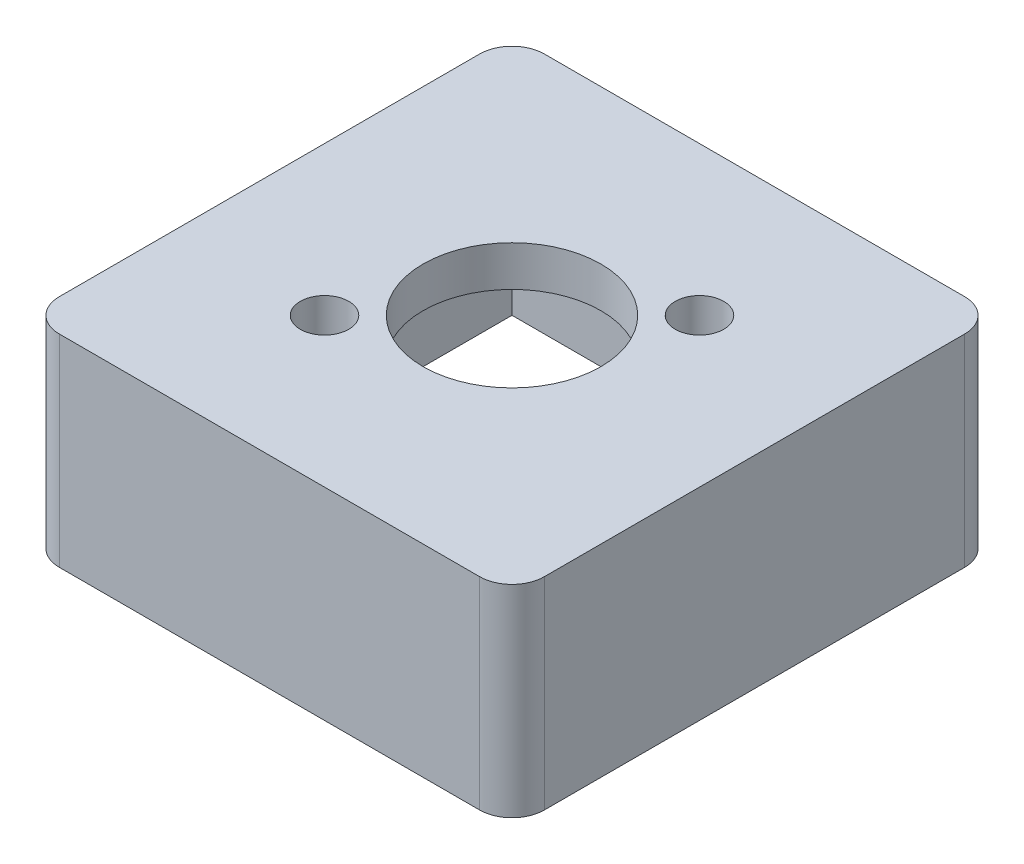
ISO-10303-21;
HEADER;
FILE_DESCRIPTION(('STEP AP214'),'2;1');
FILE_NAME('part.step','',(''),(''),'','','');
FILE_SCHEMA(('AUTOMOTIVE_DESIGN { 1 0 10303 214 1 1 1 1 }'));
ENDSEC;
DATA;
#1=APPLICATION_CONTEXT('core data for automotive mechanical design processes');
#2=APPLICATION_PROTOCOL_DEFINITION('international standard','automotive_design',2000,#1);
#3=PRODUCT_CONTEXT('',#1,'mechanical');
#4=PRODUCT('Part','Part','',(#3));
#5=PRODUCT_RELATED_PRODUCT_CATEGORY('part','',(#4));
#6=PRODUCT_DEFINITION_FORMATION('','',#4);
#7=PRODUCT_DEFINITION_CONTEXT('part definition',#1,'design');
#8=PRODUCT_DEFINITION('design','',#6,#7);
#9=PRODUCT_DEFINITION_SHAPE('','',#8);
#10=(LENGTH_UNIT() NAMED_UNIT(*) SI_UNIT(.MILLI.,.METRE.));
#11=(NAMED_UNIT(*) PLANE_ANGLE_UNIT() SI_UNIT($,.RADIAN.));
#12=(NAMED_UNIT(*) SI_UNIT($,.STERADIAN.) SOLID_ANGLE_UNIT());
#13=UNCERTAINTY_MEASURE_WITH_UNIT(LENGTH_MEASURE(1.E-05),#10,'distance_accuracy_value','');
#14=(GEOMETRIC_REPRESENTATION_CONTEXT(3) GLOBAL_UNCERTAINTY_ASSIGNED_CONTEXT((#13)) GLOBAL_UNIT_ASSIGNED_CONTEXT((#10,
#11,#12)) REPRESENTATION_CONTEXT('',''));
#15=CARTESIAN_POINT('',(0.,0.,0.));
#16=DIRECTION('',(0.,0.,1.));
#17=DIRECTION('',(1.,0.,0.));
#18=AXIS2_PLACEMENT_3D('',#15,#16,#17);
#19=CARTESIAN_POINT('',(0.,0.,0.));
#20=DIRECTION('',(0.,1.,0.));
#21=DIRECTION('',(0.,0.,1.));
#22=AXIS2_PLACEMENT_3D('',#19,#20,#21);
#23=PLANE('',#22);
#24=CARTESIAN_POINT('',(7.36381001927669,0.,-7.36381001927672));
#25=DIRECTION('',(0.,1.,0.));
#26=DIRECTION('',(0.,0.,1.));
#27=AXIS2_PLACEMENT_3D('',#24,#25,#26);
#28=CIRCLE('',#27,1.905);
#29=CARTESIAN_POINT('',(7.36381001927669,0.,-5.45881001927672));
#30=VERTEX_POINT('',#29);
#31=EDGE_CURVE('E208',#30,#30,#28,.F.);
#32=ORIENTED_EDGE('',*,*,#31,.F.);
#33=EDGE_LOOP('',(#32));
#34=FACE_BOUND('',#33,.T.);
#35=CARTESIAN_POINT('',(-7.36381001927671,0.,7.3638100192767));
#36=DIRECTION('',(0.,1.,0.));
#37=DIRECTION('',(0.,0.,1.));
#38=AXIS2_PLACEMENT_3D('',#35,#36,#37);
#39=CIRCLE('',#38,1.905);
#40=CARTESIAN_POINT('',(-7.36381001927671,0.,9.2688100192767));
#41=VERTEX_POINT('',#40);
#42=EDGE_CURVE('E234',#41,#41,#39,.T.);
#43=ORIENTED_EDGE('',*,*,#42,.T.);
#44=EDGE_LOOP('',(#43));
#45=FACE_BOUND('',#44,.T.);
#46=CARTESIAN_POINT('',(0.,0.,0.));
#47=DIRECTION('',(0.,1.,0.));
#48=DIRECTION('',(0.,0.,1.));
#49=AXIS2_PLACEMENT_3D('',#46,#47,#48);
#50=CIRCLE('',#49,6.985);
#51=CARTESIAN_POINT('',(0.,0.,6.985));
#52=VERTEX_POINT('',#51);
#53=EDGE_CURVE('E196',#52,#52,#50,.T.);
#54=ORIENTED_EDGE('',*,*,#53,.T.);
#55=EDGE_LOOP('',(#54));
#56=FACE_BOUND('',#55,.T.);
#57=DIRECTION('',(0.,0.,-1.));
#58=VECTOR('',#57,1.);
#59=CARTESIAN_POINT('',(15.875,0.,0.));
#60=LINE('',#59,#58);
#61=CARTESIAN_POINT('',(15.875,0.,15.875));
#62=VERTEX_POINT('',#61);
#63=CARTESIAN_POINT('',(15.875,0.,-15.875));
#64=VERTEX_POINT('',#63);
#65=EDGE_CURVE('E187',#62,#64,#60,.T.);
#66=ORIENTED_EDGE('',*,*,#65,.F.);
#67=DIRECTION('',(1.,0.,0.));
#68=VECTOR('',#67,1.);
#69=CARTESIAN_POINT('',(0.,0.,15.875));
#70=LINE('',#69,#68);
#71=CARTESIAN_POINT('',(-15.875,0.,15.875));
#72=VERTEX_POINT('',#71);
#73=EDGE_CURVE('E150',#72,#62,#70,.T.);
#74=ORIENTED_EDGE('',*,*,#73,.F.);
#75=DIRECTION('',(0.,0.,-1.));
#76=VECTOR('',#75,1.);
#77=CARTESIAN_POINT('',(-15.875,0.,0.));
#78=LINE('',#77,#76);
#79=CARTESIAN_POINT('',(-15.875,0.,-15.875));
#80=VERTEX_POINT('',#79);
#81=EDGE_CURVE('E165',#72,#80,#78,.T.);
#82=ORIENTED_EDGE('',*,*,#81,.T.);
#83=DIRECTION('',(1.,0.,0.));
#84=VECTOR('',#83,1.);
#85=CARTESIAN_POINT('',(0.,0.,-15.875));
#86=LINE('',#85,#84);
#87=EDGE_CURVE('E162',#80,#64,#86,.T.);
#88=ORIENTED_EDGE('',*,*,#87,.T.);
#89=EDGE_LOOP('',(#66,#74,#82,#88));
#90=FACE_BOUND('',#89,.T.);
#91=ADVANCED_FACE('F40',(#34,#45,#56,#90),#23,.F.);
#92=CARTESIAN_POINT('',(0.,3.175,19.05));
#93=DIRECTION('',(0.,0.,-1.));
#94=DIRECTION('',(-1.,0.,0.));
#95=AXIS2_PLACEMENT_3D('',#92,#93,#94);
#96=PLANE('',#95);
#97=DIRECTION('',(1.,0.,0.));
#98=VECTOR('',#97,1.);
#99=CARTESIAN_POINT('',(0.,3.175,19.05));
#100=LINE('',#99,#98);
#101=CARTESIAN_POINT('',(-16.51,3.175,19.05));
#102=VERTEX_POINT('',#101);
#103=CARTESIAN_POINT('',(16.51,3.175,19.05));
#104=VERTEX_POINT('',#103);
#105=EDGE_CURVE('E216',#102,#104,#100,.T.);
#106=ORIENTED_EDGE('',*,*,#105,.F.);
#107=DIRECTION('',(0.,-1.,0.));
#108=VECTOR('',#107,1.);
#109=CARTESIAN_POINT('',(-16.51,-12.7,19.05));
#110=LINE('',#109,#108);
#111=CARTESIAN_POINT('',(-16.51,-12.7,19.05));
#112=VERTEX_POINT('',#111);
#113=EDGE_CURVE('E11',#102,#112,#110,.T.);
#114=ORIENTED_EDGE('',*,*,#113,.T.);
#115=DIRECTION('',(1.,0.,0.));
#116=VECTOR('',#115,1.);
#117=CARTESIAN_POINT('',(0.,-12.7,19.05));
#118=LINE('',#117,#116);
#119=CARTESIAN_POINT('',(16.51,-12.7,19.05));
#120=VERTEX_POINT('',#119);
#121=EDGE_CURVE('E173',#112,#120,#118,.T.);
#122=ORIENTED_EDGE('',*,*,#121,.T.);
#123=DIRECTION('',(0.,-1.,0.));
#124=VECTOR('',#123,1.);
#125=CARTESIAN_POINT('',(16.51,3.175,19.05));
#126=LINE('',#125,#124);
#127=EDGE_CURVE('E49',#120,#104,#126,.F.);
#128=ORIENTED_EDGE('',*,*,#127,.T.);
#129=EDGE_LOOP('',(#106,#114,#122,#128));
#130=FACE_BOUND('',#129,.T.);
#131=ADVANCED_FACE('F286',(#130),#96,.F.);
#132=CARTESIAN_POINT('',(19.05,3.175,0.));
#133=DIRECTION('',(-1.,0.,0.));
#134=DIRECTION('',(0.,0.,1.));
#135=AXIS2_PLACEMENT_3D('',#132,#133,#134);
#136=PLANE('',#135);
#137=DIRECTION('',(0.,0.,-1.));
#138=VECTOR('',#137,1.);
#139=CARTESIAN_POINT('',(19.05,-12.7,0.));
#140=LINE('',#139,#138);
#141=CARTESIAN_POINT('',(19.05,-12.7,16.51));
#142=VERTEX_POINT('',#141);
#143=CARTESIAN_POINT('',(19.05,-12.7,-16.51));
#144=VERTEX_POINT('',#143);
#145=EDGE_CURVE('E177',#142,#144,#140,.T.);
#146=ORIENTED_EDGE('',*,*,#145,.T.);
#147=DIRECTION('',(0.,-1.,0.));
#148=VECTOR('',#147,1.);
#149=CARTESIAN_POINT('',(19.05,3.175,-16.51));
#150=LINE('',#149,#148);
#151=CARTESIAN_POINT('',(19.05,3.175,-16.51));
#152=VERTEX_POINT('',#151);
#153=EDGE_CURVE('E56',#144,#152,#150,.F.);
#154=ORIENTED_EDGE('',*,*,#153,.T.);
#155=DIRECTION('',(0.,0.,-1.));
#156=VECTOR('',#155,1.);
#157=CARTESIAN_POINT('',(19.05,3.175,0.));
#158=LINE('',#157,#156);
#159=CARTESIAN_POINT('',(19.05,3.175,16.51));
#160=VERTEX_POINT('',#159);
#161=EDGE_CURVE('E219',#160,#152,#158,.T.);
#162=ORIENTED_EDGE('',*,*,#161,.F.);
#163=DIRECTION('',(0.,-1.,0.));
#164=VECTOR('',#163,1.);
#165=CARTESIAN_POINT('',(19.05,3.175,16.51));
#166=LINE('',#165,#164);
#167=EDGE_CURVE('E277',#160,#142,#166,.T.);
#168=ORIENTED_EDGE('',*,*,#167,.T.);
#169=EDGE_LOOP('',(#146,#154,#162,#168));
#170=FACE_BOUND('',#169,.T.);
#171=ADVANCED_FACE('F296',(#170),#136,.F.);
#172=CARTESIAN_POINT('',(0.,3.175,-19.05));
#173=DIRECTION('',(0.,0.,-1.));
#174=DIRECTION('',(-1.,0.,0.));
#175=AXIS2_PLACEMENT_3D('',#172,#173,#174);
#176=PLANE('',#175);
#177=DIRECTION('',(1.,0.,0.));
#178=VECTOR('',#177,1.);
#179=CARTESIAN_POINT('',(0.,-12.7,-19.05));
#180=LINE('',#179,#178);
#181=CARTESIAN_POINT('',(-16.51,-12.7,-19.05));
#182=VERTEX_POINT('',#181);
#183=CARTESIAN_POINT('',(16.51,-12.7,-19.05));
#184=VERTEX_POINT('',#183);
#185=EDGE_CURVE('E180',#182,#184,#180,.T.);
#186=ORIENTED_EDGE('',*,*,#185,.F.);
#187=DIRECTION('',(0.,-1.,0.));
#188=VECTOR('',#187,1.);
#189=CARTESIAN_POINT('',(-16.51,3.175,-19.05));
#190=LINE('',#189,#188);
#191=CARTESIAN_POINT('',(-16.51,3.175,-19.05));
#192=VERTEX_POINT('',#191);
#193=EDGE_CURVE('E263',#182,#192,#190,.F.);
#194=ORIENTED_EDGE('',*,*,#193,.T.);
#195=DIRECTION('',(1.,0.,0.));
#196=VECTOR('',#195,1.);
#197=CARTESIAN_POINT('',(0.,3.175,-19.05));
#198=LINE('',#197,#196);
#199=CARTESIAN_POINT('',(16.51,3.175,-19.05));
#200=VERTEX_POINT('',#199);
#201=EDGE_CURVE('E222',#192,#200,#198,.T.);
#202=ORIENTED_EDGE('',*,*,#201,.T.);
#203=DIRECTION('',(0.,-1.,0.));
#204=VECTOR('',#203,1.);
#205=CARTESIAN_POINT('',(16.51,-12.7,-19.05));
#206=LINE('',#205,#204);
#207=EDGE_CURVE('E259',#200,#184,#206,.T.);
#208=ORIENTED_EDGE('',*,*,#207,.T.);
#209=EDGE_LOOP('',(#186,#194,#202,#208));
#210=FACE_BOUND('',#209,.T.);
#211=ADVANCED_FACE('F303',(#210),#176,.T.);
#212=CARTESIAN_POINT('',(7.36381001927669,3.175,-7.36381001927672));
#213=DIRECTION('',(0.,-1.,0.));
#214=DIRECTION('',(0.,0.,-1.));
#215=AXIS2_PLACEMENT_3D('',#212,#213,#214);
#216=CYLINDRICAL_SURFACE('',#215,1.905);
#217=CARTESIAN_POINT('',(7.36381001927669,3.175,-7.36381001927672));
#218=DIRECTION('',(0.,1.,0.));
#219=DIRECTION('',(0.,0.,1.));
#220=AXIS2_PLACEMENT_3D('',#217,#218,#219);
#221=CIRCLE('',#220,1.905);
#222=CARTESIAN_POINT('',(7.36381001927669,3.175,-5.45881001927672));
#223=VERTEX_POINT('',#222);
#224=EDGE_CURVE('E212',#223,#223,#221,.F.);
#225=ORIENTED_EDGE('',*,*,#224,.F.);
#226=EDGE_LOOP('',(#225));
#227=FACE_BOUND('',#226,.T.);
#228=ORIENTED_EDGE('',*,*,#31,.T.);
#229=EDGE_LOOP('',(#228));
#230=FACE_BOUND('',#229,.T.);
#231=ADVANCED_FACE('F339',(#227,#230),#216,.F.);
#232=CARTESIAN_POINT('',(-7.36381001927671,3.175,7.3638100192767));
#233=DIRECTION('',(0.,-1.,0.));
#234=DIRECTION('',(0.,0.,-1.));
#235=AXIS2_PLACEMENT_3D('',#232,#233,#234);
#236=CYLINDRICAL_SURFACE('',#235,1.905);
#237=CARTESIAN_POINT('',(-7.36381001927671,3.175,7.3638100192767));
#238=DIRECTION('',(0.,1.,0.));
#239=DIRECTION('',(0.,0.,1.));
#240=AXIS2_PLACEMENT_3D('',#237,#238,#239);
#241=CIRCLE('',#240,1.905);
#242=CARTESIAN_POINT('',(-7.36381001927671,3.175,9.2688100192767));
#243=VERTEX_POINT('',#242);
#244=EDGE_CURVE('E207',#243,#243,#241,.T.);
#245=ORIENTED_EDGE('',*,*,#244,.T.);
#246=EDGE_LOOP('',(#245));
#247=FACE_BOUND('',#246,.T.);
#248=ORIENTED_EDGE('',*,*,#42,.F.);
#249=EDGE_LOOP('',(#248));
#250=FACE_BOUND('',#249,.T.);
#251=ADVANCED_FACE('F344',(#247,#250),#236,.F.);
#252=CARTESIAN_POINT('',(0.,3.175,0.));
#253=DIRECTION('',(0.,-1.,0.));
#254=DIRECTION('',(0.,0.,-1.));
#255=AXIS2_PLACEMENT_3D('',#252,#253,#254);
#256=CYLINDRICAL_SURFACE('',#255,6.985);
#257=CARTESIAN_POINT('',(0.,3.175,0.));
#258=DIRECTION('',(0.,1.,0.));
#259=DIRECTION('',(0.,0.,1.));
#260=AXIS2_PLACEMENT_3D('',#257,#258,#259);
#261=CIRCLE('',#260,6.985);
#262=CARTESIAN_POINT('',(0.,3.175,6.985));
#263=VERTEX_POINT('',#262);
#264=EDGE_CURVE('E203',#263,#263,#261,.T.);
#265=ORIENTED_EDGE('',*,*,#264,.T.);
#266=EDGE_LOOP('',(#265));
#267=FACE_BOUND('',#266,.T.);
#268=ORIENTED_EDGE('',*,*,#53,.F.);
#269=EDGE_LOOP('',(#268));
#270=FACE_BOUND('',#269,.T.);
#271=ADVANCED_FACE('F336',(#267,#270),#256,.F.);
#272=CARTESIAN_POINT('',(-19.05,3.175,0.));
#273=DIRECTION('',(-1.,0.,0.));
#274=DIRECTION('',(0.,0.,1.));
#275=AXIS2_PLACEMENT_3D('',#272,#273,#274);
#276=PLANE('',#275);
#277=DIRECTION('',(0.,0.,-1.));
#278=VECTOR('',#277,1.);
#279=CARTESIAN_POINT('',(-19.05,3.175,0.));
#280=LINE('',#279,#278);
#281=CARTESIAN_POINT('',(-19.05,3.175,16.51));
#282=VERTEX_POINT('',#281);
#283=CARTESIAN_POINT('',(-19.05,3.175,-16.51));
#284=VERTEX_POINT('',#283);
#285=EDGE_CURVE('E226',#282,#284,#280,.T.);
#286=ORIENTED_EDGE('',*,*,#285,.T.);
#287=DIRECTION('',(0.,-1.,0.));
#288=VECTOR('',#287,1.);
#289=CARTESIAN_POINT('',(-19.05,3.175,-16.51));
#290=LINE('',#289,#288);
#291=CARTESIAN_POINT('',(-19.05,-12.7,-16.51));
#292=VERTEX_POINT('',#291);
#293=EDGE_CURVE('E243',#284,#292,#290,.T.);
#294=ORIENTED_EDGE('',*,*,#293,.T.);
#295=DIRECTION('',(0.,0.,-1.));
#296=VECTOR('',#295,1.);
#297=CARTESIAN_POINT('',(-19.05,-12.7,0.));
#298=LINE('',#297,#296);
#299=CARTESIAN_POINT('',(-19.05,-12.7,16.51));
#300=VERTEX_POINT('',#299);
#301=EDGE_CURVE('E155',#300,#292,#298,.T.);
#302=ORIENTED_EDGE('',*,*,#301,.F.);
#303=DIRECTION('',(0.,-1.,0.));
#304=VECTOR('',#303,1.);
#305=CARTESIAN_POINT('',(-19.05,3.175,16.51));
#306=LINE('',#305,#304);
#307=EDGE_CURVE('E230',#300,#282,#306,.F.);
#308=ORIENTED_EDGE('',*,*,#307,.T.);
#309=EDGE_LOOP('',(#286,#294,#302,#308));
#310=FACE_BOUND('',#309,.T.);
#311=ADVANCED_FACE('F311',(#310),#276,.T.);
#312=CARTESIAN_POINT('',(0.,3.175,0.));
#313=DIRECTION('',(0.,1.,0.));
#314=DIRECTION('',(0.,0.,1.));
#315=AXIS2_PLACEMENT_3D('',#312,#313,#314);
#316=PLANE('',#315);
#317=ORIENTED_EDGE('',*,*,#264,.F.);
#318=EDGE_LOOP('',(#317));
#319=FACE_BOUND('',#318,.T.);
#320=ORIENTED_EDGE('',*,*,#244,.F.);
#321=EDGE_LOOP('',(#320));
#322=FACE_BOUND('',#321,.T.);
#323=ORIENTED_EDGE('',*,*,#224,.T.);
#324=EDGE_LOOP('',(#323));
#325=FACE_BOUND('',#324,.T.);
#326=ORIENTED_EDGE('',*,*,#201,.F.);
#327=CARTESIAN_POINT('',(-16.51,3.175,-16.51));
#328=DIRECTION('',(0.,1.,0.));
#329=DIRECTION('',(0.,0.,1.));
#330=AXIS2_PLACEMENT_3D('',#327,#328,#329);
#331=CIRCLE('',#330,2.54);
#332=EDGE_CURVE('E274',#192,#284,#331,.T.);
#333=ORIENTED_EDGE('',*,*,#332,.T.);
#334=ORIENTED_EDGE('',*,*,#285,.F.);
#335=CARTESIAN_POINT('',(-16.51,3.175,16.51));
#336=DIRECTION('',(0.,1.,0.));
#337=DIRECTION('',(0.,0.,1.));
#338=AXIS2_PLACEMENT_3D('',#335,#336,#337);
#339=CIRCLE('',#338,2.54);
#340=EDGE_CURVE('E268',#282,#102,#339,.T.);
#341=ORIENTED_EDGE('',*,*,#340,.T.);
#342=ORIENTED_EDGE('',*,*,#105,.T.);
#343=CARTESIAN_POINT('',(16.51,3.175,16.51));
#344=DIRECTION('',(0.,1.,0.));
#345=DIRECTION('',(0.,0.,1.));
#346=AXIS2_PLACEMENT_3D('',#343,#344,#345);
#347=CIRCLE('',#346,2.54);
#348=EDGE_CURVE('E63',#104,#160,#347,.T.);
#349=ORIENTED_EDGE('',*,*,#348,.T.);
#350=ORIENTED_EDGE('',*,*,#161,.T.);
#351=CARTESIAN_POINT('',(16.51,3.175,-16.51));
#352=DIRECTION('',(0.,1.,0.));
#353=DIRECTION('',(0.,0.,1.));
#354=AXIS2_PLACEMENT_3D('',#351,#352,#353);
#355=CIRCLE('',#354,2.54);
#356=EDGE_CURVE('E271',#152,#200,#355,.T.);
#357=ORIENTED_EDGE('',*,*,#356,.T.);
#358=EDGE_LOOP('',(#326,#333,#334,#341,#342,#349,#350,#357));
#359=FACE_BOUND('',#358,.T.);
#360=ADVANCED_FACE('F291',(#319,#322,#325,#359),#316,.T.);
#361=CARTESIAN_POINT('',(15.875,-12.7,0.));
#362=DIRECTION('',(1.,0.,0.));
#363=DIRECTION('',(0.,0.,-1.));
#364=AXIS2_PLACEMENT_3D('',#361,#362,#363);
#365=PLANE('',#364);
#366=ORIENTED_EDGE('',*,*,#65,.T.);
#367=DIRECTION('',(0.,1.,0.));
#368=VECTOR('',#367,1.);
#369=CARTESIAN_POINT('',(15.875,-12.7,-15.875));
#370=LINE('',#369,#368);
#371=CARTESIAN_POINT('',(15.875,-12.7,-15.875));
#372=VERTEX_POINT('',#371);
#373=EDGE_CURVE('E159',#372,#64,#370,.T.);
#374=ORIENTED_EDGE('',*,*,#373,.F.);
#375=DIRECTION('',(0.,0.,-1.));
#376=VECTOR('',#375,1.);
#377=CARTESIAN_POINT('',(15.875,-12.7,0.));
#378=LINE('',#377,#376);
#379=CARTESIAN_POINT('',(15.875,-12.7,15.875));
#380=VERTEX_POINT('',#379);
#381=EDGE_CURVE('E138',#380,#372,#378,.T.);
#382=ORIENTED_EDGE('',*,*,#381,.F.);
#383=DIRECTION('',(0.,1.,0.));
#384=VECTOR('',#383,1.);
#385=CARTESIAN_POINT('',(15.875,-12.7,15.875));
#386=LINE('',#385,#384);
#387=EDGE_CURVE('E148',#380,#62,#386,.T.);
#388=ORIENTED_EDGE('',*,*,#387,.T.);
#389=EDGE_LOOP('',(#366,#374,#382,#388));
#390=FACE_BOUND('',#389,.T.);
#391=ADVANCED_FACE('F157',(#390),#365,.F.);
#392=CARTESIAN_POINT('',(0.,-12.7,-15.875));
#393=DIRECTION('',(0.,0.,1.));
#394=DIRECTION('',(1.,0.,0.));
#395=AXIS2_PLACEMENT_3D('',#392,#393,#394);
#396=PLANE('',#395);
#397=ORIENTED_EDGE('',*,*,#87,.F.);
#398=DIRECTION('',(0.,1.,0.));
#399=VECTOR('',#398,1.);
#400=CARTESIAN_POINT('',(-15.875,-12.7,-15.875));
#401=LINE('',#400,#399);
#402=CARTESIAN_POINT('',(-15.875,-12.7,-15.875));
#403=VERTEX_POINT('',#402);
#404=EDGE_CURVE('E197',#403,#80,#401,.T.);
#405=ORIENTED_EDGE('',*,*,#404,.F.);
#406=DIRECTION('',(1.,0.,0.));
#407=VECTOR('',#406,1.);
#408=CARTESIAN_POINT('',(0.,-12.7,-15.875));
#409=LINE('',#408,#407);
#410=EDGE_CURVE('E170',#403,#372,#409,.T.);
#411=ORIENTED_EDGE('',*,*,#410,.T.);
#412=ORIENTED_EDGE('',*,*,#373,.T.);
#413=EDGE_LOOP('',(#397,#405,#411,#412));
#414=FACE_BOUND('',#413,.T.);
#415=ADVANCED_FACE('F364',(#414),#396,.T.);
#416=CARTESIAN_POINT('',(-15.875,-12.7,0.));
#417=DIRECTION('',(1.,0.,0.));
#418=DIRECTION('',(0.,0.,-1.));
#419=AXIS2_PLACEMENT_3D('',#416,#417,#418);
#420=PLANE('',#419);
#421=ORIENTED_EDGE('',*,*,#81,.F.);
#422=DIRECTION('',(0.,1.,0.));
#423=VECTOR('',#422,1.);
#424=CARTESIAN_POINT('',(-15.875,-12.7,15.875));
#425=LINE('',#424,#423);
#426=CARTESIAN_POINT('',(-15.875,-12.7,15.875));
#427=VERTEX_POINT('',#426);
#428=EDGE_CURVE('E154',#427,#72,#425,.T.);
#429=ORIENTED_EDGE('',*,*,#428,.F.);
#430=DIRECTION('',(0.,0.,-1.));
#431=VECTOR('',#430,1.);
#432=CARTESIAN_POINT('',(-15.875,-12.7,0.));
#433=LINE('',#432,#431);
#434=EDGE_CURVE('E141',#427,#403,#433,.T.);
#435=ORIENTED_EDGE('',*,*,#434,.T.);
#436=ORIENTED_EDGE('',*,*,#404,.T.);
#437=EDGE_LOOP('',(#421,#429,#435,#436));
#438=FACE_BOUND('',#437,.T.);
#439=ADVANCED_FACE('F361',(#438),#420,.T.);
#440=CARTESIAN_POINT('',(0.,-12.7,15.875));
#441=DIRECTION('',(0.,0.,1.));
#442=DIRECTION('',(1.,0.,0.));
#443=AXIS2_PLACEMENT_3D('',#440,#441,#442);
#444=PLANE('',#443);
#445=ORIENTED_EDGE('',*,*,#73,.T.);
#446=ORIENTED_EDGE('',*,*,#387,.F.);
#447=DIRECTION('',(1.,0.,0.));
#448=VECTOR('',#447,1.);
#449=CARTESIAN_POINT('',(0.,-12.7,15.875));
#450=LINE('',#449,#448);
#451=EDGE_CURVE('E132',#427,#380,#450,.T.);
#452=ORIENTED_EDGE('',*,*,#451,.F.);
#453=ORIENTED_EDGE('',*,*,#428,.T.);
#454=EDGE_LOOP('',(#445,#446,#452,#453));
#455=FACE_BOUND('',#454,.T.);
#456=ADVANCED_FACE('F149',(#455),#444,.F.);
#457=CARTESIAN_POINT('',(0.,-12.7,0.));
#458=DIRECTION('',(0.,1.,0.));
#459=DIRECTION('',(0.,0.,1.));
#460=AXIS2_PLACEMENT_3D('',#457,#458,#459);
#461=PLANE('',#460);
#462=ORIENTED_EDGE('',*,*,#381,.T.);
#463=ORIENTED_EDGE('',*,*,#410,.F.);
#464=ORIENTED_EDGE('',*,*,#434,.F.);
#465=ORIENTED_EDGE('',*,*,#451,.T.);
#466=EDGE_LOOP('',(#462,#463,#464,#465));
#467=FACE_BOUND('',#466,.T.);
#468=ORIENTED_EDGE('',*,*,#301,.T.);
#469=CARTESIAN_POINT('',(-16.51,-12.7,-16.51));
#470=DIRECTION('',(0.,1.,0.));
#471=DIRECTION('',(0.,0.,1.));
#472=AXIS2_PLACEMENT_3D('',#469,#470,#471);
#473=CIRCLE('',#472,2.54);
#474=EDGE_CURVE('E256',#292,#182,#473,.F.);
#475=ORIENTED_EDGE('',*,*,#474,.T.);
#476=ORIENTED_EDGE('',*,*,#185,.T.);
#477=CARTESIAN_POINT('',(16.51,-12.7,-16.51));
#478=DIRECTION('',(0.,1.,0.));
#479=DIRECTION('',(0.,0.,1.));
#480=AXIS2_PLACEMENT_3D('',#477,#478,#479);
#481=CIRCLE('',#480,2.54);
#482=EDGE_CURVE('E253',#184,#144,#481,.F.);
#483=ORIENTED_EDGE('',*,*,#482,.T.);
#484=ORIENTED_EDGE('',*,*,#145,.F.);
#485=CARTESIAN_POINT('',(16.51,-12.7,16.51));
#486=DIRECTION('',(0.,1.,0.));
#487=DIRECTION('',(0.,0.,1.));
#488=AXIS2_PLACEMENT_3D('',#485,#486,#487);
#489=CIRCLE('',#488,2.54);
#490=EDGE_CURVE('E247',#142,#120,#489,.F.);
#491=ORIENTED_EDGE('',*,*,#490,.T.);
#492=ORIENTED_EDGE('',*,*,#121,.F.);
#493=CARTESIAN_POINT('',(-16.51,-12.7,16.51));
#494=DIRECTION('',(0.,1.,0.));
#495=DIRECTION('',(0.,0.,1.));
#496=AXIS2_PLACEMENT_3D('',#493,#494,#495);
#497=CIRCLE('',#496,2.54);
#498=EDGE_CURVE('E250',#112,#300,#497,.F.);
#499=ORIENTED_EDGE('',*,*,#498,.T.);
#500=EDGE_LOOP('',(#468,#475,#476,#483,#484,#491,#492,#499));
#501=FACE_BOUND('',#500,.T.);
#502=ADVANCED_FACE('F134',(#467,#501),#461,.F.);
#503=CARTESIAN_POINT('',(-16.51,3.175,-16.51));
#504=DIRECTION('',(0.,-1.,0.));
#505=DIRECTION('',(0.,0.,-1.));
#506=AXIS2_PLACEMENT_3D('',#503,#504,#505);
#507=CYLINDRICAL_SURFACE('',#506,2.54);
#508=ORIENTED_EDGE('',*,*,#332,.F.);
#509=ORIENTED_EDGE('',*,*,#193,.F.);
#510=ORIENTED_EDGE('',*,*,#474,.F.);
#511=ORIENTED_EDGE('',*,*,#293,.F.);
#512=EDGE_LOOP('',(#508,#509,#510,#511));
#513=FACE_BOUND('',#512,.T.);
#514=ADVANCED_FACE('F308',(#513),#507,.T.);
#515=CARTESIAN_POINT('',(16.51,3.175,-16.51));
#516=DIRECTION('',(0.,1.,0.));
#517=DIRECTION('',(0.,0.,1.));
#518=AXIS2_PLACEMENT_3D('',#515,#516,#517);
#519=CYLINDRICAL_SURFACE('',#518,2.54);
#520=ORIENTED_EDGE('',*,*,#356,.F.);
#521=ORIENTED_EDGE('',*,*,#153,.F.);
#522=ORIENTED_EDGE('',*,*,#482,.F.);
#523=ORIENTED_EDGE('',*,*,#207,.F.);
#524=EDGE_LOOP('',(#520,#521,#522,#523));
#525=FACE_BOUND('',#524,.T.);
#526=ADVANCED_FACE('F301',(#525),#519,.T.);
#527=CARTESIAN_POINT('',(-16.51,3.175,16.51));
#528=DIRECTION('',(0.,1.,0.));
#529=DIRECTION('',(0.,0.,1.));
#530=AXIS2_PLACEMENT_3D('',#527,#528,#529);
#531=CYLINDRICAL_SURFACE('',#530,2.54);
#532=ORIENTED_EDGE('',*,*,#340,.F.);
#533=ORIENTED_EDGE('',*,*,#307,.F.);
#534=ORIENTED_EDGE('',*,*,#498,.F.);
#535=ORIENTED_EDGE('',*,*,#113,.F.);
#536=EDGE_LOOP('',(#532,#533,#534,#535));
#537=FACE_BOUND('',#536,.T.);
#538=ADVANCED_FACE('F314',(#537),#531,.T.);
#539=CARTESIAN_POINT('',(16.51,3.175,16.51));
#540=DIRECTION('',(0.,-1.,0.));
#541=DIRECTION('',(0.,0.,-1.));
#542=AXIS2_PLACEMENT_3D('',#539,#540,#541);
#543=CYLINDRICAL_SURFACE('',#542,2.54);
#544=ORIENTED_EDGE('',*,*,#348,.F.);
#545=ORIENTED_EDGE('',*,*,#127,.F.);
#546=ORIENTED_EDGE('',*,*,#490,.F.);
#547=ORIENTED_EDGE('',*,*,#167,.F.);
#548=EDGE_LOOP('',(#544,#545,#546,#547));
#549=FACE_BOUND('',#548,.T.);
#550=ADVANCED_FACE('F42',(#549),#543,.T.);
#551=CLOSED_SHELL('',(#91,#131,#171,#211,#231,#251,#271,#311,#360,#391,#415,#439,#456,#502,#514,
#526,#538,#550));
#552=MANIFOLD_SOLID_BREP('B2',#551);
#553=ADVANCED_BREP_SHAPE_REPRESENTATION('',(#18,#552),#14);
#554=SHAPE_DEFINITION_REPRESENTATION(#9,#553);
ENDSEC;
END-ISO-10303-21;
